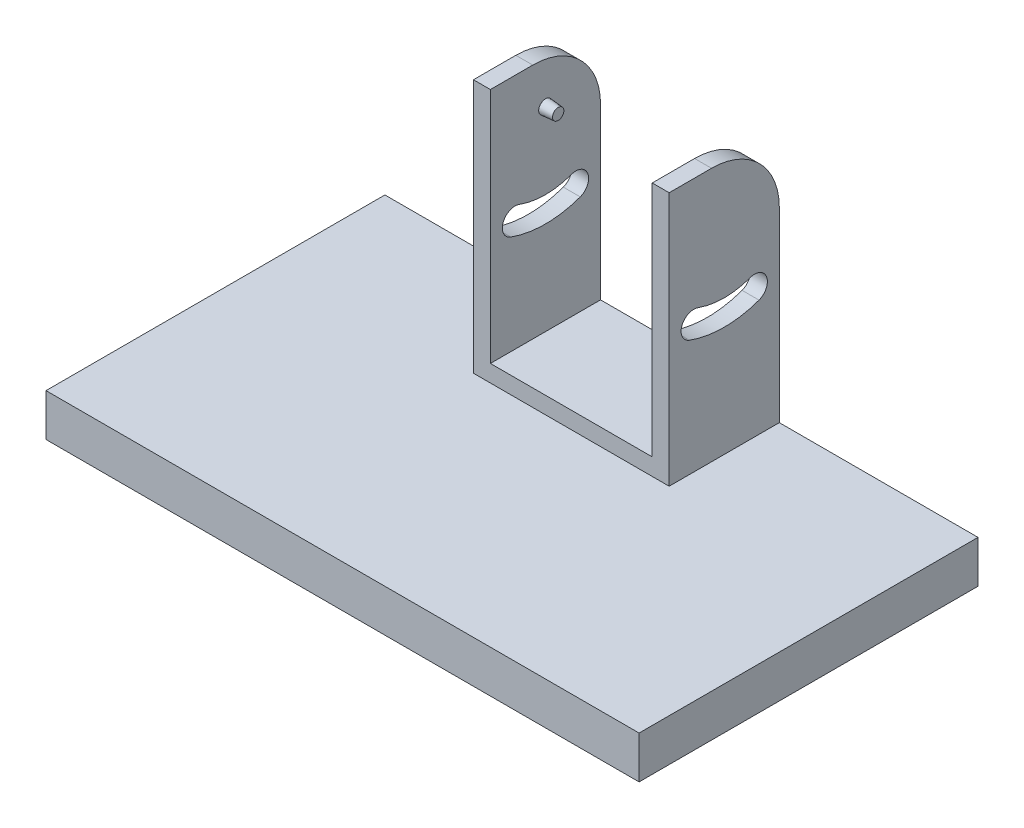
ISO-10303-21;
HEADER;
FILE_DESCRIPTION(('STEP AP214'),'2;1');
FILE_NAME('part.step','',(''),(''),'','','');
FILE_SCHEMA(('AUTOMOTIVE_DESIGN { 1 0 10303 214 1 1 1 1 }'));
ENDSEC;
DATA;
#1=APPLICATION_CONTEXT('core data for automotive mechanical design processes');
#2=APPLICATION_PROTOCOL_DEFINITION('international standard','automotive_design',2000,#1);
#3=PRODUCT_CONTEXT('',#1,'mechanical');
#4=PRODUCT('Part','Part','',(#3));
#5=PRODUCT_RELATED_PRODUCT_CATEGORY('part','',(#4));
#6=PRODUCT_DEFINITION_FORMATION('','',#4);
#7=PRODUCT_DEFINITION_CONTEXT('part definition',#1,'design');
#8=PRODUCT_DEFINITION('design','',#6,#7);
#9=PRODUCT_DEFINITION_SHAPE('','',#8);
#10=(LENGTH_UNIT() NAMED_UNIT(*) SI_UNIT(.MILLI.,.METRE.));
#11=(NAMED_UNIT(*) PLANE_ANGLE_UNIT() SI_UNIT($,.RADIAN.));
#12=(NAMED_UNIT(*) SI_UNIT($,.STERADIAN.) SOLID_ANGLE_UNIT());
#13=UNCERTAINTY_MEASURE_WITH_UNIT(LENGTH_MEASURE(1.E-05),#10,'distance_accuracy_value','');
#14=(GEOMETRIC_REPRESENTATION_CONTEXT(3) GLOBAL_UNCERTAINTY_ASSIGNED_CONTEXT((#13)) GLOBAL_UNIT_ASSIGNED_CONTEXT((#10,
#11,#12)) REPRESENTATION_CONTEXT('',''));
#15=CARTESIAN_POINT('',(0.,0.,0.));
#16=DIRECTION('',(0.,0.,1.));
#17=DIRECTION('',(1.,0.,0.));
#18=AXIS2_PLACEMENT_3D('',#15,#16,#17);
#19=CARTESIAN_POINT('',(-11.55,22.,1.5));
#20=DIRECTION('',(-1.,0.,0.));
#21=DIRECTION('',(0.,0.,1.));
#22=AXIS2_PLACEMENT_3D('',#19,#20,#21);
#23=PLANE('',#22);
#24=DIRECTION('',(0.,0.,1.));
#25=VECTOR('',#24,1.);
#26=CARTESIAN_POINT('',(-11.55,0.,-6.5));
#27=LINE('',#26,#25);
#28=CARTESIAN_POINT('',(-11.55,0.,-6.5));
#29=VERTEX_POINT('',#28);
#30=CARTESIAN_POINT('',(-11.55,0.,6.5));
#31=VERTEX_POINT('',#30);
#32=EDGE_CURVE('E297',#29,#31,#27,.T.);
#33=ORIENTED_EDGE('',*,*,#32,.T.);
#34=DIRECTION('',(0.,1.,0.));
#35=VECTOR('',#34,1.);
#36=CARTESIAN_POINT('',(-11.55,0.,6.5));
#37=LINE('',#36,#35);
#38=CARTESIAN_POINT('',(-11.55,30.,6.5));
#39=VERTEX_POINT('',#38);
#40=EDGE_CURVE('E300',#31,#39,#37,.T.);
#41=ORIENTED_EDGE('',*,*,#40,.T.);
#42=DIRECTION('',(0.,0.,-1.));
#43=VECTOR('',#42,1.);
#44=CARTESIAN_POINT('',(-11.55,30.,6.5));
#45=LINE('',#44,#43);
#46=CARTESIAN_POINT('',(-11.55,30.,1.5));
#47=VERTEX_POINT('',#46);
#48=EDGE_CURVE('E303',#39,#47,#45,.T.);
#49=ORIENTED_EDGE('',*,*,#48,.T.);
#50=CARTESIAN_POINT('',(-11.55,22.,1.5));
#51=DIRECTION('',(-1.,0.,0.));
#52=DIRECTION('',(0.,0.,1.));
#53=AXIS2_PLACEMENT_3D('',#50,#51,#52);
#54=CIRCLE('',#53,8.);
#55=CARTESIAN_POINT('',(-11.55,22.,-6.5));
#56=VERTEX_POINT('',#55);
#57=EDGE_CURVE('E305',#47,#56,#54,.T.);
#58=ORIENTED_EDGE('',*,*,#57,.T.);
#59=DIRECTION('',(0.,-1.,0.));
#60=VECTOR('',#59,1.);
#61=CARTESIAN_POINT('',(-11.55,22.,-6.5));
#62=LINE('',#61,#60);
#63=EDGE_CURVE('E307',#56,#29,#62,.T.);
#64=ORIENTED_EDGE('',*,*,#63,.T.);
#65=EDGE_LOOP('',(#33,#41,#49,#58,#64));
#66=FACE_BOUND('',#65,.T.);
#67=CARTESIAN_POINT('',(-11.55,25.,0.));
#68=DIRECTION('',(1.,0.,0.));
#69=DIRECTION('',(0.,0.,-1.));
#70=AXIS2_PLACEMENT_3D('',#67,#68,#69);
#71=CIRCLE('',#70,12.);
#72=CARTESIAN_POINT('',(-11.55,13.7236885505691,-4.10424171990804));
#73=VERTEX_POINT('',#72);
#74=CARTESIAN_POINT('',(-11.55,13.7236885505691,4.10424171990804));
#75=VERTEX_POINT('',#74);
#76=EDGE_CURVE('E231',#73,#75,#71,.F.);
#77=ORIENTED_EDGE('',*,*,#76,.F.);
#78=CARTESIAN_POINT('',(-11.55,15.133227481748,-3.59121150491953));
#79=DIRECTION('',(1.,0.,0.));
#80=DIRECTION('',(0.,0.,-1.));
#81=AXIS2_PLACEMENT_3D('',#78,#79,#80);
#82=CIRCLE('',#81,1.5);
#83=CARTESIAN_POINT('',(-11.55,16.5427664129268,-3.07818128993103));
#84=VERTEX_POINT('',#83);
#85=EDGE_CURVE('E226',#84,#73,#82,.F.);
#86=ORIENTED_EDGE('',*,*,#85,.F.);
#87=CARTESIAN_POINT('',(-11.55,25.,0.));
#88=DIRECTION('',(1.,0.,0.));
#89=DIRECTION('',(0.,0.,-1.));
#90=AXIS2_PLACEMENT_3D('',#87,#88,#89);
#91=CIRCLE('',#90,9.);
#92=CARTESIAN_POINT('',(-11.55,16.5427664129268,3.07818128993103));
#93=VERTEX_POINT('',#92);
#94=EDGE_CURVE('E228',#93,#84,#91,.T.);
#95=ORIENTED_EDGE('',*,*,#94,.F.);
#96=CARTESIAN_POINT('',(-11.55,15.133227481748,3.59121150491953));
#97=DIRECTION('',(1.,0.,0.));
#98=DIRECTION('',(0.,0.,-1.));
#99=AXIS2_PLACEMENT_3D('',#96,#97,#98);
#100=CIRCLE('',#99,1.5);
#101=EDGE_CURVE('E49',#93,#75,#100,.T.);
#102=ORIENTED_EDGE('',*,*,#101,.T.);
#103=EDGE_LOOP('',(#77,#86,#95,#102));
#104=FACE_BOUND('',#103,.T.);
#105=ADVANCED_FACE('F34',(#66,#104),#23,.T.);
#106=CARTESIAN_POINT('',(-9.55,22.,1.5));
#107=DIRECTION('',(-1.,0.,0.));
#108=DIRECTION('',(0.,0.,1.));
#109=AXIS2_PLACEMENT_3D('',#106,#107,#108);
#110=PLANE('',#109);
#111=DIRECTION('',(0.,0.,1.));
#112=VECTOR('',#111,1.);
#113=CARTESIAN_POINT('',(-9.55,2.,6.5));
#114=LINE('',#113,#112);
#115=CARTESIAN_POINT('',(-9.55,2.,-6.5));
#116=VERTEX_POINT('',#115);
#117=CARTESIAN_POINT('',(-9.55,2.,6.5));
#118=VERTEX_POINT('',#117);
#119=EDGE_CURVE('E326',#116,#118,#114,.T.);
#120=ORIENTED_EDGE('',*,*,#119,.F.);
#121=DIRECTION('',(0.,-1.,0.));
#122=VECTOR('',#121,1.);
#123=CARTESIAN_POINT('',(-9.55,22.,-6.5));
#124=LINE('',#123,#122);
#125=CARTESIAN_POINT('',(-9.55,22.,-6.5));
#126=VERTEX_POINT('',#125);
#127=EDGE_CURVE('E301',#126,#116,#124,.T.);
#128=ORIENTED_EDGE('',*,*,#127,.F.);
#129=CARTESIAN_POINT('',(-9.55,22.,1.5));
#130=DIRECTION('',(-1.,0.,0.));
#131=DIRECTION('',(0.,0.,1.));
#132=AXIS2_PLACEMENT_3D('',#129,#130,#131);
#133=CIRCLE('',#132,8.);
#134=CARTESIAN_POINT('',(-9.55,30.,1.5));
#135=VERTEX_POINT('',#134);
#136=EDGE_CURVE('E313',#135,#126,#133,.T.);
#137=ORIENTED_EDGE('',*,*,#136,.F.);
#138=DIRECTION('',(0.,0.,-1.));
#139=VECTOR('',#138,1.);
#140=CARTESIAN_POINT('',(-9.55,30.,6.5));
#141=LINE('',#140,#139);
#142=CARTESIAN_POINT('',(-9.55,30.,6.5));
#143=VERTEX_POINT('',#142);
#144=EDGE_CURVE('E311',#143,#135,#141,.T.);
#145=ORIENTED_EDGE('',*,*,#144,.F.);
#146=DIRECTION('',(0.,1.,0.));
#147=VECTOR('',#146,1.);
#148=CARTESIAN_POINT('',(-9.55,0.,6.5));
#149=LINE('',#148,#147);
#150=EDGE_CURVE('E296',#118,#143,#149,.T.);
#151=ORIENTED_EDGE('',*,*,#150,.F.);
#152=EDGE_LOOP('',(#120,#128,#137,#145,#151));
#153=FACE_BOUND('',#152,.T.);
#154=CARTESIAN_POINT('',(-9.55,25.,0.));
#155=DIRECTION('',(-1.,0.,0.));
#156=DIRECTION('',(0.,0.,1.));
#157=AXIS2_PLACEMENT_3D('',#154,#155,#156);
#158=CIRCLE('',#157,0.799999999999999);
#159=CARTESIAN_POINT('',(-9.55,25.,0.799999999999999));
#160=VERTEX_POINT('',#159);
#161=EDGE_CURVE('E338',#160,#160,#158,.F.);
#162=ORIENTED_EDGE('',*,*,#161,.F.);
#163=EDGE_LOOP('',(#162));
#164=FACE_BOUND('',#163,.T.);
#165=CARTESIAN_POINT('',(-9.55,15.133227481748,-3.59121150491953));
#166=DIRECTION('',(-1.,0.,0.));
#167=DIRECTION('',(0.,0.,1.));
#168=AXIS2_PLACEMENT_3D('',#165,#166,#167);
#169=CIRCLE('',#168,1.5);
#170=CARTESIAN_POINT('',(-9.55,13.7236885505691,-4.10424171990804));
#171=VERTEX_POINT('',#170);
#172=CARTESIAN_POINT('',(-9.55,16.5427664129268,-3.07818128993103));
#173=VERTEX_POINT('',#172);
#174=EDGE_CURVE('E253',#171,#173,#169,.F.);
#175=ORIENTED_EDGE('',*,*,#174,.F.);
#176=CARTESIAN_POINT('',(-9.55,25.,0.));
#177=DIRECTION('',(-1.,0.,0.));
#178=DIRECTION('',(0.,0.,1.));
#179=AXIS2_PLACEMENT_3D('',#176,#177,#178);
#180=CIRCLE('',#179,12.);
#181=CARTESIAN_POINT('',(-9.55,13.7236885505691,4.10424171990804));
#182=VERTEX_POINT('',#181);
#183=EDGE_CURVE('E251',#182,#171,#180,.F.);
#184=ORIENTED_EDGE('',*,*,#183,.F.);
#185=CARTESIAN_POINT('',(-9.55,15.133227481748,3.59121150491953));
#186=DIRECTION('',(-1.,0.,0.));
#187=DIRECTION('',(0.,0.,1.));
#188=AXIS2_PLACEMENT_3D('',#185,#186,#187);
#189=CIRCLE('',#188,1.5);
#190=CARTESIAN_POINT('',(-9.55,16.5427664129268,3.07818128993103));
#191=VERTEX_POINT('',#190);
#192=EDGE_CURVE('E248',#182,#191,#189,.T.);
#193=ORIENTED_EDGE('',*,*,#192,.T.);
#194=CARTESIAN_POINT('',(-9.55,25.,0.));
#195=DIRECTION('',(-1.,0.,0.));
#196=DIRECTION('',(0.,0.,1.));
#197=AXIS2_PLACEMENT_3D('',#194,#195,#196);
#198=CIRCLE('',#197,9.);
#199=EDGE_CURVE('E237',#173,#191,#198,.T.);
#200=ORIENTED_EDGE('',*,*,#199,.F.);
#201=EDGE_LOOP('',(#175,#184,#193,#200));
#202=FACE_BOUND('',#201,.T.);
#203=ADVANCED_FACE('F371',(#153,#164,#202),#110,.F.);
#204=CARTESIAN_POINT('',(11.55,22.,1.5));
#205=DIRECTION('',(1.,0.,0.));
#206=DIRECTION('',(0.,0.,1.));
#207=AXIS2_PLACEMENT_3D('',#204,#205,#206);
#208=PLANE('',#207);
#209=DIRECTION('',(0.,0.,1.));
#210=VECTOR('',#209,1.);
#211=CARTESIAN_POINT('',(11.55,0.,-6.5));
#212=LINE('',#211,#210);
#213=CARTESIAN_POINT('',(11.55,0.,-6.5));
#214=VERTEX_POINT('',#213);
#215=CARTESIAN_POINT('',(11.55,0.,6.5));
#216=VERTEX_POINT('',#215);
#217=EDGE_CURVE('E262',#214,#216,#212,.T.);
#218=ORIENTED_EDGE('',*,*,#217,.F.);
#219=DIRECTION('',(0.,-1.,0.));
#220=VECTOR('',#219,1.);
#221=CARTESIAN_POINT('',(11.55,22.,-6.5));
#222=LINE('',#221,#220);
#223=CARTESIAN_POINT('',(11.55,22.,-6.5));
#224=VERTEX_POINT('',#223);
#225=EDGE_CURVE('E265',#224,#214,#222,.T.);
#226=ORIENTED_EDGE('',*,*,#225,.F.);
#227=CARTESIAN_POINT('',(11.55,22.,1.5));
#228=DIRECTION('',(-1.,0.,0.));
#229=DIRECTION('',(0.,0.,1.));
#230=AXIS2_PLACEMENT_3D('',#227,#228,#229);
#231=CIRCLE('',#230,8.);
#232=CARTESIAN_POINT('',(11.55,30.,1.5));
#233=VERTEX_POINT('',#232);
#234=EDGE_CURVE('E269',#233,#224,#231,.T.);
#235=ORIENTED_EDGE('',*,*,#234,.F.);
#236=DIRECTION('',(0.,0.,-1.));
#237=VECTOR('',#236,1.);
#238=CARTESIAN_POINT('',(11.55,30.,6.5));
#239=LINE('',#238,#237);
#240=CARTESIAN_POINT('',(11.55,30.,6.5));
#241=VERTEX_POINT('',#240);
#242=EDGE_CURVE('E272',#241,#233,#239,.T.);
#243=ORIENTED_EDGE('',*,*,#242,.F.);
#244=DIRECTION('',(0.,1.,0.));
#245=VECTOR('',#244,1.);
#246=CARTESIAN_POINT('',(11.55,0.,6.5));
#247=LINE('',#246,#245);
#248=EDGE_CURVE('E275',#216,#241,#247,.T.);
#249=ORIENTED_EDGE('',*,*,#248,.F.);
#250=EDGE_LOOP('',(#218,#226,#235,#243,#249));
#251=FACE_BOUND('',#250,.T.);
#252=CARTESIAN_POINT('',(11.55,25.,0.));
#253=DIRECTION('',(1.,0.,0.));
#254=DIRECTION('',(0.,0.,-1.));
#255=AXIS2_PLACEMENT_3D('',#252,#253,#254);
#256=CIRCLE('',#255,9.);
#257=CARTESIAN_POINT('',(11.55,16.5427664129268,3.07818128993103));
#258=VERTEX_POINT('',#257);
#259=CARTESIAN_POINT('',(11.55,16.5427664129268,-3.07818128993103));
#260=VERTEX_POINT('',#259);
#261=EDGE_CURVE('E212',#258,#260,#256,.T.);
#262=ORIENTED_EDGE('',*,*,#261,.T.);
#263=CARTESIAN_POINT('',(11.55,15.133227481748,-3.59121150491953));
#264=DIRECTION('',(1.,0.,0.));
#265=DIRECTION('',(0.,0.,-1.));
#266=AXIS2_PLACEMENT_3D('',#263,#264,#265);
#267=CIRCLE('',#266,1.5);
#268=CARTESIAN_POINT('',(11.55,13.7236885505691,-4.10424171990804));
#269=VERTEX_POINT('',#268);
#270=EDGE_CURVE('E209',#260,#269,#267,.F.);
#271=ORIENTED_EDGE('',*,*,#270,.T.);
#272=CARTESIAN_POINT('',(11.55,25.,0.));
#273=DIRECTION('',(1.,0.,0.));
#274=DIRECTION('',(0.,0.,-1.));
#275=AXIS2_PLACEMENT_3D('',#272,#273,#274);
#276=CIRCLE('',#275,12.);
#277=CARTESIAN_POINT('',(11.55,13.7236885505691,4.10424171990804));
#278=VERTEX_POINT('',#277);
#279=EDGE_CURVE('E223',#269,#278,#276,.F.);
#280=ORIENTED_EDGE('',*,*,#279,.T.);
#281=CARTESIAN_POINT('',(11.55,15.133227481748,3.59121150491953));
#282=DIRECTION('',(1.,0.,0.));
#283=DIRECTION('',(0.,0.,-1.));
#284=AXIS2_PLACEMENT_3D('',#281,#282,#283);
#285=CIRCLE('',#284,1.5);
#286=EDGE_CURVE('E220',#258,#278,#285,.T.);
#287=ORIENTED_EDGE('',*,*,#286,.F.);
#288=EDGE_LOOP('',(#262,#271,#280,#287));
#289=FACE_BOUND('',#288,.T.);
#290=ADVANCED_FACE('F369',(#251,#289),#208,.T.);
#291=CARTESIAN_POINT('',(9.55,22.,1.5));
#292=DIRECTION('',(1.,0.,0.));
#293=DIRECTION('',(0.,0.,1.));
#294=AXIS2_PLACEMENT_3D('',#291,#292,#293);
#295=PLANE('',#294);
#296=DIRECTION('',(0.,0.,-1.));
#297=VECTOR('',#296,1.);
#298=CARTESIAN_POINT('',(9.55,2.,6.5));
#299=LINE('',#298,#297);
#300=CARTESIAN_POINT('',(9.55,2.,6.5));
#301=VERTEX_POINT('',#300);
#302=CARTESIAN_POINT('',(9.55,2.,-6.5));
#303=VERTEX_POINT('',#302);
#304=EDGE_CURVE('E332',#301,#303,#299,.T.);
#305=ORIENTED_EDGE('',*,*,#304,.F.);
#306=DIRECTION('',(0.,1.,0.));
#307=VECTOR('',#306,1.);
#308=CARTESIAN_POINT('',(9.55,0.,6.5));
#309=LINE('',#308,#307);
#310=CARTESIAN_POINT('',(9.55,30.,6.5));
#311=VERTEX_POINT('',#310);
#312=EDGE_CURVE('E266',#301,#311,#309,.T.);
#313=ORIENTED_EDGE('',*,*,#312,.T.);
#314=DIRECTION('',(0.,0.,-1.));
#315=VECTOR('',#314,1.);
#316=CARTESIAN_POINT('',(9.55,30.,6.5));
#317=LINE('',#316,#315);
#318=CARTESIAN_POINT('',(9.55,30.,1.5));
#319=VERTEX_POINT('',#318);
#320=EDGE_CURVE('E283',#311,#319,#317,.T.);
#321=ORIENTED_EDGE('',*,*,#320,.T.);
#322=CARTESIAN_POINT('',(9.55,22.,1.5));
#323=DIRECTION('',(-1.,0.,0.));
#324=DIRECTION('',(0.,0.,1.));
#325=AXIS2_PLACEMENT_3D('',#322,#323,#324);
#326=CIRCLE('',#325,8.);
#327=CARTESIAN_POINT('',(9.55,22.,-6.5));
#328=VERTEX_POINT('',#327);
#329=EDGE_CURVE('E280',#319,#328,#326,.T.);
#330=ORIENTED_EDGE('',*,*,#329,.T.);
#331=DIRECTION('',(0.,-1.,0.));
#332=VECTOR('',#331,1.);
#333=CARTESIAN_POINT('',(9.55,22.,-6.5));
#334=LINE('',#333,#332);
#335=EDGE_CURVE('E261',#328,#303,#334,.T.);
#336=ORIENTED_EDGE('',*,*,#335,.T.);
#337=EDGE_LOOP('',(#305,#313,#321,#330,#336));
#338=FACE_BOUND('',#337,.T.);
#339=CARTESIAN_POINT('',(9.55,25.,0.));
#340=DIRECTION('',(1.,0.,0.));
#341=DIRECTION('',(0.,0.,-1.));
#342=AXIS2_PLACEMENT_3D('',#339,#340,#341);
#343=CIRCLE('',#342,0.799999999999999);
#344=CARTESIAN_POINT('',(9.55,25.,-0.799999999999999));
#345=VERTEX_POINT('',#344);
#346=EDGE_CURVE('E255',#345,#345,#343,.T.);
#347=ORIENTED_EDGE('',*,*,#346,.T.);
#348=EDGE_LOOP('',(#347));
#349=FACE_BOUND('',#348,.T.);
#350=CARTESIAN_POINT('',(9.55,15.133227481748,-3.59121150491953));
#351=DIRECTION('',(1.,0.,0.));
#352=DIRECTION('',(0.,0.,-1.));
#353=AXIS2_PLACEMENT_3D('',#350,#351,#352);
#354=CIRCLE('',#353,1.5);
#355=CARTESIAN_POINT('',(9.55,16.5427664129268,-3.07818128993103));
#356=VERTEX_POINT('',#355);
#357=CARTESIAN_POINT('',(9.55,13.7236885505691,-4.10424171990804));
#358=VERTEX_POINT('',#357);
#359=EDGE_CURVE('E11',#356,#358,#354,.F.);
#360=ORIENTED_EDGE('',*,*,#359,.F.);
#361=CARTESIAN_POINT('',(9.55,25.,0.));
#362=DIRECTION('',(1.,0.,0.));
#363=DIRECTION('',(0.,0.,-1.));
#364=AXIS2_PLACEMENT_3D('',#361,#362,#363);
#365=CIRCLE('',#364,9.);
#366=CARTESIAN_POINT('',(9.55,16.5427664129268,3.07818128993103));
#367=VERTEX_POINT('',#366);
#368=EDGE_CURVE('E343',#367,#356,#365,.T.);
#369=ORIENTED_EDGE('',*,*,#368,.F.);
#370=CARTESIAN_POINT('',(9.55,15.133227481748,3.59121150491953));
#371=DIRECTION('',(1.,0.,0.));
#372=DIRECTION('',(0.,0.,-1.));
#373=AXIS2_PLACEMENT_3D('',#370,#371,#372);
#374=CIRCLE('',#373,1.5);
#375=CARTESIAN_POINT('',(9.55,13.7236885505691,4.10424171990804));
#376=VERTEX_POINT('',#375);
#377=EDGE_CURVE('E345',#367,#376,#374,.T.);
#378=ORIENTED_EDGE('',*,*,#377,.T.);
#379=CARTESIAN_POINT('',(9.55,25.,0.));
#380=DIRECTION('',(1.,0.,0.));
#381=DIRECTION('',(0.,0.,-1.));
#382=AXIS2_PLACEMENT_3D('',#379,#380,#381);
#383=CIRCLE('',#382,12.);
#384=EDGE_CURVE('E42',#358,#376,#383,.F.);
#385=ORIENTED_EDGE('',*,*,#384,.F.);
#386=EDGE_LOOP('',(#360,#369,#378,#385));
#387=FACE_BOUND('',#386,.T.);
#388=ADVANCED_FACE('F360',(#338,#349,#387),#295,.F.);
#389=CARTESIAN_POINT('',(9.55,2.,6.5));
#390=DIRECTION('',(0.,0.,-1.));
#391=DIRECTION('',(-1.,0.,0.));
#392=AXIS2_PLACEMENT_3D('',#389,#390,#391);
#393=PLANE('',#392);
#394=DIRECTION('',(1.,0.,0.));
#395=VECTOR('',#394,1.);
#396=CARTESIAN_POINT('',(9.55,0.,6.5));
#397=LINE('',#396,#395);
#398=EDGE_CURVE('E325',#31,#216,#397,.T.);
#399=ORIENTED_EDGE('',*,*,#398,.T.);
#400=ORIENTED_EDGE('',*,*,#248,.T.);
#401=DIRECTION('',(-1.,0.,0.));
#402=VECTOR('',#401,1.);
#403=CARTESIAN_POINT('',(11.55,30.,6.5));
#404=LINE('',#403,#402);
#405=EDGE_CURVE('E278',#241,#311,#404,.T.);
#406=ORIENTED_EDGE('',*,*,#405,.T.);
#407=ORIENTED_EDGE('',*,*,#312,.F.);
#408=DIRECTION('',(1.,0.,0.));
#409=VECTOR('',#408,1.);
#410=CARTESIAN_POINT('',(9.55,2.,6.5));
#411=LINE('',#410,#409);
#412=EDGE_CURVE('E329',#118,#301,#411,.T.);
#413=ORIENTED_EDGE('',*,*,#412,.F.);
#414=ORIENTED_EDGE('',*,*,#150,.T.);
#415=DIRECTION('',(1.,0.,0.));
#416=VECTOR('',#415,1.);
#417=CARTESIAN_POINT('',(-11.55,30.,6.5));
#418=LINE('',#417,#416);
#419=EDGE_CURVE('E322',#39,#143,#418,.T.);
#420=ORIENTED_EDGE('',*,*,#419,.F.);
#421=ORIENTED_EDGE('',*,*,#40,.F.);
#422=EDGE_LOOP('',(#399,#400,#406,#407,#413,#414,#420,#421));
#423=FACE_BOUND('',#422,.T.);
#424=ADVANCED_FACE('F36',(#423),#393,.F.);
#425=CARTESIAN_POINT('',(9.55,2.,-6.5));
#426=DIRECTION('',(0.,0.,1.));
#427=DIRECTION('',(1.,0.,0.));
#428=AXIS2_PLACEMENT_3D('',#425,#426,#427);
#429=PLANE('',#428);
#430=ORIENTED_EDGE('',*,*,#225,.T.);
#431=DIRECTION('',(1.,0.,0.));
#432=VECTOR('',#431,1.);
#433=CARTESIAN_POINT('',(-35.,0.,-6.5));
#434=LINE('',#433,#432);
#435=CARTESIAN_POINT('',(35.,0.,-6.5));
#436=VERTEX_POINT('',#435);
#437=EDGE_CURVE('E413',#214,#436,#434,.T.);
#438=ORIENTED_EDGE('',*,*,#437,.T.);
#439=DIRECTION('',(0.,1.,0.));
#440=VECTOR('',#439,1.);
#441=CARTESIAN_POINT('',(35.,-5.,-6.5));
#442=LINE('',#441,#440);
#443=CARTESIAN_POINT('',(35.,-5.,-6.5));
#444=VERTEX_POINT('',#443);
#445=EDGE_CURVE('E427',#444,#436,#442,.T.);
#446=ORIENTED_EDGE('',*,*,#445,.F.);
#447=DIRECTION('',(1.,0.,0.));
#448=VECTOR('',#447,1.);
#449=CARTESIAN_POINT('',(-35.,-5.,-6.5));
#450=LINE('',#449,#448);
#451=CARTESIAN_POINT('',(-35.,-5.,-6.5));
#452=VERTEX_POINT('',#451);
#453=EDGE_CURVE('E200',#452,#444,#450,.T.);
#454=ORIENTED_EDGE('',*,*,#453,.F.);
#455=DIRECTION('',(0.,1.,0.));
#456=VECTOR('',#455,1.);
#457=CARTESIAN_POINT('',(-35.,-5.,-6.5));
#458=LINE('',#457,#456);
#459=CARTESIAN_POINT('',(-35.,0.,-6.5));
#460=VERTEX_POINT('',#459);
#461=EDGE_CURVE('E214',#452,#460,#458,.T.);
#462=ORIENTED_EDGE('',*,*,#461,.T.);
#463=EDGE_CURVE('E204',#460,#29,#434,.T.);
#464=ORIENTED_EDGE('',*,*,#463,.T.);
#465=ORIENTED_EDGE('',*,*,#63,.F.);
#466=DIRECTION('',(1.,0.,0.));
#467=VECTOR('',#466,1.);
#468=CARTESIAN_POINT('',(-11.55,22.,-6.5));
#469=LINE('',#468,#467);
#470=EDGE_CURVE('E309',#56,#126,#469,.T.);
#471=ORIENTED_EDGE('',*,*,#470,.T.);
#472=ORIENTED_EDGE('',*,*,#127,.T.);
#473=DIRECTION('',(-1.,0.,0.));
#474=VECTOR('',#473,1.);
#475=CARTESIAN_POINT('',(9.55,2.,-6.5));
#476=LINE('',#475,#474);
#477=EDGE_CURVE('E335',#303,#116,#476,.T.);
#478=ORIENTED_EDGE('',*,*,#477,.F.);
#479=ORIENTED_EDGE('',*,*,#335,.F.);
#480=DIRECTION('',(-1.,0.,0.));
#481=VECTOR('',#480,1.);
#482=CARTESIAN_POINT('',(11.55,22.,-6.5));
#483=LINE('',#482,#481);
#484=EDGE_CURVE('E291',#224,#328,#483,.T.);
#485=ORIENTED_EDGE('',*,*,#484,.F.);
#486=EDGE_LOOP('',(#430,#438,#446,#454,#462,#464,#465,#471,#472,#478,#479,#485));
#487=FACE_BOUND('',#486,.T.);
#488=ADVANCED_FACE('F403',(#487),#429,.F.);
#489=CARTESIAN_POINT('',(0.,2.,0.));
#490=DIRECTION('',(0.,1.,0.));
#491=DIRECTION('',(0.,0.,1.));
#492=AXIS2_PLACEMENT_3D('',#489,#490,#491);
#493=PLANE('',#492);
#494=ORIENTED_EDGE('',*,*,#119,.T.);
#495=ORIENTED_EDGE('',*,*,#412,.T.);
#496=ORIENTED_EDGE('',*,*,#304,.T.);
#497=ORIENTED_EDGE('',*,*,#477,.T.);
#498=EDGE_LOOP('',(#494,#495,#496,#497));
#499=FACE_BOUND('',#498,.T.);
#500=ADVANCED_FACE('F400',(#499),#493,.T.);
#501=CARTESIAN_POINT('',(-11.55,30.,6.5));
#502=DIRECTION('',(0.,-1.,0.));
#503=DIRECTION('',(0.,0.,-1.));
#504=AXIS2_PLACEMENT_3D('',#501,#502,#503);
#505=PLANE('',#504);
#506=ORIENTED_EDGE('',*,*,#144,.T.);
#507=DIRECTION('',(1.,0.,0.));
#508=VECTOR('',#507,1.);
#509=CARTESIAN_POINT('',(-11.55,30.,1.5));
#510=LINE('',#509,#508);
#511=EDGE_CURVE('E319',#47,#135,#510,.T.);
#512=ORIENTED_EDGE('',*,*,#511,.F.);
#513=ORIENTED_EDGE('',*,*,#48,.F.);
#514=ORIENTED_EDGE('',*,*,#419,.T.);
#515=EDGE_LOOP('',(#506,#512,#513,#514));
#516=FACE_BOUND('',#515,.T.);
#517=ADVANCED_FACE('F396',(#516),#505,.F.);
#518=CARTESIAN_POINT('',(-11.55,22.,1.5));
#519=DIRECTION('',(1.,0.,0.));
#520=DIRECTION('',(0.,0.,-1.));
#521=AXIS2_PLACEMENT_3D('',#518,#519,#520);
#522=CYLINDRICAL_SURFACE('',#521,8.);
#523=ORIENTED_EDGE('',*,*,#136,.T.);
#524=ORIENTED_EDGE('',*,*,#470,.F.);
#525=ORIENTED_EDGE('',*,*,#57,.F.);
#526=ORIENTED_EDGE('',*,*,#511,.T.);
#527=EDGE_LOOP('',(#523,#524,#525,#526));
#528=FACE_BOUND('',#527,.T.);
#529=ADVANCED_FACE('F393',(#528),#522,.T.);
#530=CARTESIAN_POINT('',(-9.55,25.,0.));
#531=DIRECTION('',(-1.,0.,0.));
#532=DIRECTION('',(0.,0.,-1.));
#533=AXIS2_PLACEMENT_3D('',#530,#531,#532);
#534=CONICAL_SURFACE('',#533,0.799999999999999,0.0872664625997165);
#535=CARTESIAN_POINT('',(-8.05,25.,0.));
#536=DIRECTION('',(1.,0.,0.));
#537=DIRECTION('',(0.,0.,-1.));
#538=AXIS2_PLACEMENT_3D('',#535,#536,#537);
#539=CIRCLE('',#538,0.668767004711113);
#540=CARTESIAN_POINT('',(-8.05,25.,-0.668767004711113));
#541=VERTEX_POINT('',#540);
#542=EDGE_CURVE('E293',#541,#541,#539,.T.);
#543=ORIENTED_EDGE('',*,*,#542,.F.);
#544=EDGE_LOOP('',(#543));
#545=FACE_BOUND('',#544,.T.);
#546=ORIENTED_EDGE('',*,*,#161,.T.);
#547=EDGE_LOOP('',(#546));
#548=FACE_BOUND('',#547,.T.);
#549=ADVANCED_FACE('F390',(#545,#548),#534,.T.);
#550=CARTESIAN_POINT('',(-8.05,25.,0.));
#551=DIRECTION('',(1.,0.,0.));
#552=DIRECTION('',(0.,0.,-1.));
#553=AXIS2_PLACEMENT_3D('',#550,#551,#552);
#554=PLANE('',#553);
#555=ORIENTED_EDGE('',*,*,#542,.T.);
#556=EDGE_LOOP('',(#555));
#557=FACE_BOUND('',#556,.T.);
#558=ADVANCED_FACE('F463',(#557),#554,.T.);
#559=CARTESIAN_POINT('',(11.55,22.,1.5));
#560=DIRECTION('',(-1.,0.,0.));
#561=DIRECTION('',(0.,0.,1.));
#562=AXIS2_PLACEMENT_3D('',#559,#560,#561);
#563=CYLINDRICAL_SURFACE('',#562,8.);
#564=ORIENTED_EDGE('',*,*,#329,.F.);
#565=DIRECTION('',(-1.,0.,0.));
#566=VECTOR('',#565,1.);
#567=CARTESIAN_POINT('',(11.55,30.,1.5));
#568=LINE('',#567,#566);
#569=EDGE_CURVE('E289',#233,#319,#568,.T.);
#570=ORIENTED_EDGE('',*,*,#569,.F.);
#571=ORIENTED_EDGE('',*,*,#234,.T.);
#572=ORIENTED_EDGE('',*,*,#484,.T.);
#573=EDGE_LOOP('',(#564,#570,#571,#572));
#574=FACE_BOUND('',#573,.T.);
#575=ADVANCED_FACE('F447',(#574),#563,.T.);
#576=CARTESIAN_POINT('',(11.55,30.,6.5));
#577=DIRECTION('',(0.,1.,0.));
#578=DIRECTION('',(0.,0.,1.));
#579=AXIS2_PLACEMENT_3D('',#576,#577,#578);
#580=PLANE('',#579);
#581=ORIENTED_EDGE('',*,*,#320,.F.);
#582=ORIENTED_EDGE('',*,*,#405,.F.);
#583=ORIENTED_EDGE('',*,*,#242,.T.);
#584=ORIENTED_EDGE('',*,*,#569,.T.);
#585=EDGE_LOOP('',(#581,#582,#583,#584));
#586=FACE_BOUND('',#585,.T.);
#587=ADVANCED_FACE('F450',(#586),#580,.T.);
#588=CARTESIAN_POINT('',(9.55,25.,0.));
#589=DIRECTION('',(1.,0.,0.));
#590=DIRECTION('',(0.,0.,-1.));
#591=AXIS2_PLACEMENT_3D('',#588,#589,#590);
#592=CONICAL_SURFACE('',#591,0.799999999999999,0.0872664625997165);
#593=CARTESIAN_POINT('',(8.05,25.,0.));
#594=DIRECTION('',(-1.,0.,0.));
#595=DIRECTION('',(0.,0.,1.));
#596=AXIS2_PLACEMENT_3D('',#593,#594,#595);
#597=CIRCLE('',#596,0.668767004711113);
#598=CARTESIAN_POINT('',(8.05,25.,0.668767004711113));
#599=VERTEX_POINT('',#598);
#600=EDGE_CURVE('E258',#599,#599,#597,.F.);
#601=ORIENTED_EDGE('',*,*,#600,.T.);
#602=EDGE_LOOP('',(#601));
#603=FACE_BOUND('',#602,.T.);
#604=ORIENTED_EDGE('',*,*,#346,.F.);
#605=EDGE_LOOP('',(#604));
#606=FACE_BOUND('',#605,.T.);
#607=ADVANCED_FACE('F455',(#603,#606),#592,.T.);
#608=CARTESIAN_POINT('',(8.05,25.,0.));
#609=DIRECTION('',(-1.,0.,0.));
#610=DIRECTION('',(0.,0.,-1.));
#611=AXIS2_PLACEMENT_3D('',#608,#609,#610);
#612=PLANE('',#611);
#613=ORIENTED_EDGE('',*,*,#600,.F.);
#614=EDGE_LOOP('',(#613));
#615=FACE_BOUND('',#614,.T.);
#616=ADVANCED_FACE('F461',(#615),#612,.T.);
#617=CARTESIAN_POINT('',(-11.55,25.,0.));
#618=DIRECTION('',(1.,0.,0.));
#619=DIRECTION('',(0.,0.,-1.));
#620=AXIS2_PLACEMENT_3D('',#617,#618,#619);
#621=CYLINDRICAL_SURFACE('',#620,9.);
#622=ORIENTED_EDGE('',*,*,#368,.T.);
#623=DIRECTION('',(1.,0.,0.));
#624=VECTOR('',#623,1.);
#625=CARTESIAN_POINT('',(-11.55,16.5427664129268,-3.07818128993103));
#626=LINE('',#625,#624);
#627=EDGE_CURVE('E233',#356,#260,#626,.T.);
#628=ORIENTED_EDGE('',*,*,#627,.T.);
#629=ORIENTED_EDGE('',*,*,#261,.F.);
#630=DIRECTION('',(1.,0.,0.));
#631=VECTOR('',#630,1.);
#632=CARTESIAN_POINT('',(-11.55,16.5427664129268,3.07818128993103));
#633=LINE('',#632,#631);
#634=EDGE_CURVE('E245',#367,#258,#633,.T.);
#635=ORIENTED_EDGE('',*,*,#634,.F.);
#636=EDGE_LOOP('',(#622,#628,#629,#635));
#637=FACE_BOUND('',#636,.T.);
#638=ADVANCED_FACE('F364',(#637),#621,.T.);
#639=CARTESIAN_POINT('',(-11.55,15.133227481748,3.59121150491953));
#640=DIRECTION('',(1.,0.,0.));
#641=DIRECTION('',(0.,0.,-1.));
#642=AXIS2_PLACEMENT_3D('',#639,#640,#641);
#643=CYLINDRICAL_SURFACE('',#642,1.5);
#644=ORIENTED_EDGE('',*,*,#634,.T.);
#645=ORIENTED_EDGE('',*,*,#286,.T.);
#646=DIRECTION('',(1.,0.,0.));
#647=VECTOR('',#646,1.);
#648=CARTESIAN_POINT('',(-11.55,13.7236885505691,4.10424171990804));
#649=LINE('',#648,#647);
#650=EDGE_CURVE('E242',#376,#278,#649,.T.);
#651=ORIENTED_EDGE('',*,*,#650,.F.);
#652=ORIENTED_EDGE('',*,*,#377,.F.);
#653=EDGE_LOOP('',(#644,#645,#651,#652));
#654=FACE_BOUND('',#653,.T.);
#655=ADVANCED_FACE('F357',(#654),#643,.F.);
#656=CARTESIAN_POINT('',(-11.55,25.,0.));
#657=DIRECTION('',(1.,0.,0.));
#658=DIRECTION('',(0.,0.,-1.));
#659=AXIS2_PLACEMENT_3D('',#656,#657,#658);
#660=CYLINDRICAL_SURFACE('',#659,12.);
#661=ORIENTED_EDGE('',*,*,#384,.T.);
#662=ORIENTED_EDGE('',*,*,#650,.T.);
#663=ORIENTED_EDGE('',*,*,#279,.F.);
#664=DIRECTION('',(1.,0.,0.));
#665=VECTOR('',#664,1.);
#666=CARTESIAN_POINT('',(-11.55,13.7236885505691,-4.10424171990804));
#667=LINE('',#666,#665);
#668=EDGE_CURVE('E238',#358,#269,#667,.T.);
#669=ORIENTED_EDGE('',*,*,#668,.F.);
#670=EDGE_LOOP('',(#661,#662,#663,#669));
#671=FACE_BOUND('',#670,.T.);
#672=ADVANCED_FACE('F351',(#671),#660,.F.);
#673=CARTESIAN_POINT('',(-11.55,15.133227481748,-3.59121150491953));
#674=DIRECTION('',(1.,0.,0.));
#675=DIRECTION('',(0.,0.,-1.));
#676=AXIS2_PLACEMENT_3D('',#673,#674,#675);
#677=CYLINDRICAL_SURFACE('',#676,1.5);
#678=ORIENTED_EDGE('',*,*,#359,.T.);
#679=ORIENTED_EDGE('',*,*,#668,.T.);
#680=ORIENTED_EDGE('',*,*,#270,.F.);
#681=ORIENTED_EDGE('',*,*,#627,.F.);
#682=EDGE_LOOP('',(#678,#679,#680,#681));
#683=FACE_BOUND('',#682,.T.);
#684=ADVANCED_FACE('F367',(#683),#677,.F.);
#685=ORIENTED_EDGE('',*,*,#174,.T.);
#686=EDGE_CURVE('E57',#84,#173,#626,.T.);
#687=ORIENTED_EDGE('',*,*,#686,.F.);
#688=ORIENTED_EDGE('',*,*,#85,.T.);
#689=EDGE_CURVE('E234',#73,#171,#667,.T.);
#690=ORIENTED_EDGE('',*,*,#689,.T.);
#691=EDGE_LOOP('',(#685,#687,#688,#690));
#692=FACE_BOUND('',#691,.T.);
#693=ADVANCED_FACE('F479',(#692),#677,.F.);
#694=ORIENTED_EDGE('',*,*,#183,.T.);
#695=ORIENTED_EDGE('',*,*,#689,.F.);
#696=ORIENTED_EDGE('',*,*,#76,.T.);
#697=EDGE_CURVE('E239',#75,#182,#649,.T.);
#698=ORIENTED_EDGE('',*,*,#697,.T.);
#699=EDGE_LOOP('',(#694,#695,#696,#698));
#700=FACE_BOUND('',#699,.T.);
#701=ADVANCED_FACE('F484',(#700),#660,.F.);
#702=ORIENTED_EDGE('',*,*,#697,.F.);
#703=ORIENTED_EDGE('',*,*,#101,.F.);
#704=EDGE_CURVE('E243',#93,#191,#633,.T.);
#705=ORIENTED_EDGE('',*,*,#704,.T.);
#706=ORIENTED_EDGE('',*,*,#192,.F.);
#707=EDGE_LOOP('',(#702,#703,#705,#706));
#708=FACE_BOUND('',#707,.T.);
#709=ADVANCED_FACE('F487',(#708),#643,.F.);
#710=ORIENTED_EDGE('',*,*,#199,.T.);
#711=ORIENTED_EDGE('',*,*,#704,.F.);
#712=ORIENTED_EDGE('',*,*,#94,.T.);
#713=ORIENTED_EDGE('',*,*,#686,.T.);
#714=EDGE_LOOP('',(#710,#711,#712,#713));
#715=FACE_BOUND('',#714,.T.);
#716=ADVANCED_FACE('F486',(#715),#621,.T.);
#717=CARTESIAN_POINT('',(0.,0.,0.));
#718=DIRECTION('',(0.,1.,0.));
#719=DIRECTION('',(0.,0.,1.));
#720=AXIS2_PLACEMENT_3D('',#717,#718,#719);
#721=PLANE('',#720);
#722=ORIENTED_EDGE('',*,*,#32,.F.);
#723=ORIENTED_EDGE('',*,*,#463,.F.);
#724=DIRECTION('',(0.,0.,-1.));
#725=VECTOR('',#724,1.);
#726=CARTESIAN_POINT('',(-35.,0.,-6.5));
#727=LINE('',#726,#725);
#728=CARTESIAN_POINT('',(-35.,0.,33.5));
#729=VERTEX_POINT('',#728);
#730=EDGE_CURVE('E420',#729,#460,#727,.T.);
#731=ORIENTED_EDGE('',*,*,#730,.F.);
#732=DIRECTION('',(-1.,0.,0.));
#733=VECTOR('',#732,1.);
#734=CARTESIAN_POINT('',(-35.,0.,33.5));
#735=LINE('',#734,#733);
#736=CARTESIAN_POINT('',(35.,0.,33.5));
#737=VERTEX_POINT('',#736);
#738=EDGE_CURVE('E423',#737,#729,#735,.T.);
#739=ORIENTED_EDGE('',*,*,#738,.F.);
#740=DIRECTION('',(0.,0.,1.));
#741=VECTOR('',#740,1.);
#742=CARTESIAN_POINT('',(35.,0.,-6.5));
#743=LINE('',#742,#741);
#744=EDGE_CURVE('E208',#436,#737,#743,.T.);
#745=ORIENTED_EDGE('',*,*,#744,.F.);
#746=ORIENTED_EDGE('',*,*,#437,.F.);
#747=ORIENTED_EDGE('',*,*,#217,.T.);
#748=ORIENTED_EDGE('',*,*,#398,.F.);
#749=EDGE_LOOP('',(#722,#723,#731,#739,#745,#746,#747,#748));
#750=FACE_BOUND('',#749,.T.);
#751=ADVANCED_FACE('F418',(#750),#721,.T.);
#752=CARTESIAN_POINT('',(35.,-5.,-6.5));
#753=DIRECTION('',(-1.,0.,0.));
#754=DIRECTION('',(0.,0.,1.));
#755=AXIS2_PLACEMENT_3D('',#752,#753,#754);
#756=PLANE('',#755);
#757=ORIENTED_EDGE('',*,*,#744,.T.);
#758=DIRECTION('',(0.,1.,0.));
#759=VECTOR('',#758,1.);
#760=CARTESIAN_POINT('',(35.,-5.,33.5));
#761=LINE('',#760,#759);
#762=CARTESIAN_POINT('',(35.,-5.,33.5));
#763=VERTEX_POINT('',#762);
#764=EDGE_CURVE('E188',#763,#737,#761,.T.);
#765=ORIENTED_EDGE('',*,*,#764,.F.);
#766=DIRECTION('',(0.,0.,1.));
#767=VECTOR('',#766,1.);
#768=CARTESIAN_POINT('',(35.,-5.,-6.5));
#769=LINE('',#768,#767);
#770=EDGE_CURVE('E195',#444,#763,#769,.T.);
#771=ORIENTED_EDGE('',*,*,#770,.F.);
#772=ORIENTED_EDGE('',*,*,#445,.T.);
#773=EDGE_LOOP('',(#757,#765,#771,#772));
#774=FACE_BOUND('',#773,.T.);
#775=ADVANCED_FACE('F206',(#774),#756,.F.);
#776=CARTESIAN_POINT('',(-35.,-5.,33.5));
#777=DIRECTION('',(0.,0.,-1.));
#778=DIRECTION('',(-1.,0.,0.));
#779=AXIS2_PLACEMENT_3D('',#776,#777,#778);
#780=PLANE('',#779);
#781=ORIENTED_EDGE('',*,*,#738,.T.);
#782=DIRECTION('',(0.,1.,0.));
#783=VECTOR('',#782,1.);
#784=CARTESIAN_POINT('',(-35.,-5.,33.5));
#785=LINE('',#784,#783);
#786=CARTESIAN_POINT('',(-35.,-5.,33.5));
#787=VERTEX_POINT('',#786);
#788=EDGE_CURVE('E191',#787,#729,#785,.T.);
#789=ORIENTED_EDGE('',*,*,#788,.F.);
#790=DIRECTION('',(-1.,0.,0.));
#791=VECTOR('',#790,1.);
#792=CARTESIAN_POINT('',(-35.,-5.,33.5));
#793=LINE('',#792,#791);
#794=EDGE_CURVE('E184',#763,#787,#793,.T.);
#795=ORIENTED_EDGE('',*,*,#794,.F.);
#796=ORIENTED_EDGE('',*,*,#764,.T.);
#797=EDGE_LOOP('',(#781,#789,#795,#796));
#798=FACE_BOUND('',#797,.T.);
#799=ADVANCED_FACE('F186',(#798),#780,.F.);
#800=CARTESIAN_POINT('',(-35.,-5.,-6.5));
#801=DIRECTION('',(1.,0.,0.));
#802=DIRECTION('',(0.,0.,-1.));
#803=AXIS2_PLACEMENT_3D('',#800,#801,#802);
#804=PLANE('',#803);
#805=ORIENTED_EDGE('',*,*,#730,.T.);
#806=ORIENTED_EDGE('',*,*,#461,.F.);
#807=DIRECTION('',(0.,0.,-1.));
#808=VECTOR('',#807,1.);
#809=CARTESIAN_POINT('',(-35.,-5.,-6.5));
#810=LINE('',#809,#808);
#811=EDGE_CURVE('E194',#787,#452,#810,.T.);
#812=ORIENTED_EDGE('',*,*,#811,.F.);
#813=ORIENTED_EDGE('',*,*,#788,.T.);
#814=EDGE_LOOP('',(#805,#806,#812,#813));
#815=FACE_BOUND('',#814,.T.);
#816=ADVANCED_FACE('F641',(#815),#804,.F.);
#817=CARTESIAN_POINT('',(0.,-5.,0.));
#818=DIRECTION('',(0.,1.,0.));
#819=DIRECTION('',(0.,0.,1.));
#820=AXIS2_PLACEMENT_3D('',#817,#818,#819);
#821=PLANE('',#820);
#822=ORIENTED_EDGE('',*,*,#770,.T.);
#823=ORIENTED_EDGE('',*,*,#794,.T.);
#824=ORIENTED_EDGE('',*,*,#811,.T.);
#825=ORIENTED_EDGE('',*,*,#453,.T.);
#826=EDGE_LOOP('',(#822,#823,#824,#825));
#827=FACE_BOUND('',#826,.T.);
#828=ADVANCED_FACE('F198',(#827),#821,.F.);
#829=CLOSED_SHELL('',(#105,#203,#290,#388,#424,#488,#500,#517,#529,#549,#558,#575,#587,#607,
#616,#638,#655,#672,#684,#693,#701,#709,#716,#751,#775,#799,#816,#828));
#830=MANIFOLD_SOLID_BREP('B2',#829);
#831=ADVANCED_BREP_SHAPE_REPRESENTATION('',(#18,#830),#14);
#832=SHAPE_DEFINITION_REPRESENTATION(#9,#831);
ENDSEC;
END-ISO-10303-21;
